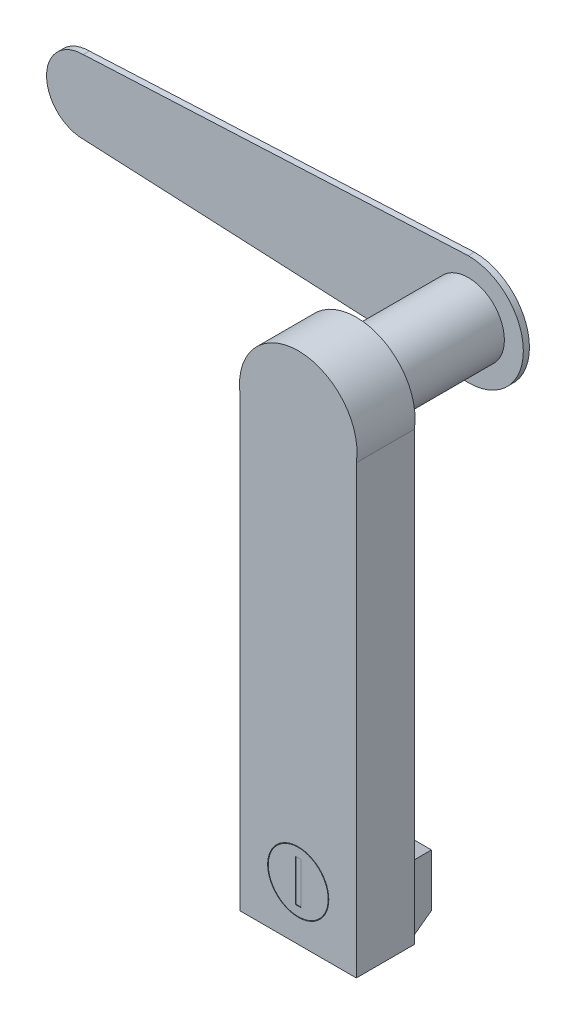
ISO-10303-21;
HEADER;
FILE_DESCRIPTION(('STEP AP214'),'2;1');
FILE_NAME('part.step','',(''),(''),'','','');
FILE_SCHEMA(('AUTOMOTIVE_DESIGN { 1 0 10303 214 1 1 1 1 }'));
ENDSEC;
DATA;
#1=APPLICATION_CONTEXT('core data for automotive mechanical design processes');
#2=APPLICATION_PROTOCOL_DEFINITION('international standard','automotive_design',2000,#1);
#3=PRODUCT_CONTEXT('',#1,'mechanical');
#4=PRODUCT('Part','Part','',(#3));
#5=PRODUCT_RELATED_PRODUCT_CATEGORY('part','',(#4));
#6=PRODUCT_DEFINITION_FORMATION('','',#4);
#7=PRODUCT_DEFINITION_CONTEXT('part definition',#1,'design');
#8=PRODUCT_DEFINITION('design','',#6,#7);
#9=PRODUCT_DEFINITION_SHAPE('','',#8);
#10=(LENGTH_UNIT() NAMED_UNIT(*) SI_UNIT(.MILLI.,.METRE.));
#11=(NAMED_UNIT(*) PLANE_ANGLE_UNIT() SI_UNIT($,.RADIAN.));
#12=(NAMED_UNIT(*) SI_UNIT($,.STERADIAN.) SOLID_ANGLE_UNIT());
#13=UNCERTAINTY_MEASURE_WITH_UNIT(LENGTH_MEASURE(1.E-05),#10,'distance_accuracy_value','');
#14=(GEOMETRIC_REPRESENTATION_CONTEXT(3) GLOBAL_UNCERTAINTY_ASSIGNED_CONTEXT((#13)) GLOBAL_UNIT_ASSIGNED_CONTEXT((#10,
#11,#12)) REPRESENTATION_CONTEXT('',''));
#15=CARTESIAN_POINT('',(0.,0.,0.));
#16=DIRECTION('',(0.,0.,1.));
#17=DIRECTION('',(1.,0.,0.));
#18=AXIS2_PLACEMENT_3D('',#15,#16,#17);
#19=CARTESIAN_POINT('',(0.,37.5,-9.5));
#20=DIRECTION('',(0.,0.,1.));
#21=DIRECTION('',(1.,0.,0.));
#22=AXIS2_PLACEMENT_3D('',#19,#20,#21);
#23=PLANE('',#22);
#24=DIRECTION('',(0.,-1.,0.));
#25=VECTOR('',#24,1.);
#26=CARTESIAN_POINT('',(9.00000000000001,-36.5,-9.5));
#27=LINE('',#26,#25);
#28=CARTESIAN_POINT('',(9.00000000000001,-25.5,-9.5));
#29=VERTEX_POINT('',#28);
#30=CARTESIAN_POINT('',(9.00000000000001,-36.5,-9.5));
#31=VERTEX_POINT('',#30);
#32=EDGE_CURVE('E220',#29,#31,#27,.T.);
#33=ORIENTED_EDGE('',*,*,#32,.F.);
#34=DIRECTION('',(1.,0.,0.));
#35=VECTOR('',#34,1.);
#36=CARTESIAN_POINT('',(9.00000000000001,-25.5,-9.5));
#37=LINE('',#36,#35);
#38=CARTESIAN_POINT('',(-8.99999999999999,-25.5,-9.5));
#39=VERTEX_POINT('',#38);
#40=EDGE_CURVE('E227',#39,#29,#37,.T.);
#41=ORIENTED_EDGE('',*,*,#40,.F.);
#42=DIRECTION('',(0.,1.,0.));
#43=VECTOR('',#42,1.);
#44=CARTESIAN_POINT('',(-8.99999999999999,-36.5,-9.5));
#45=LINE('',#44,#43);
#46=CARTESIAN_POINT('',(-8.99999999999999,-36.5,-9.5));
#47=VERTEX_POINT('',#46);
#48=EDGE_CURVE('E224',#47,#39,#45,.T.);
#49=ORIENTED_EDGE('',*,*,#48,.F.);
#50=DIRECTION('',(-1.,0.,0.));
#51=VECTOR('',#50,1.);
#52=CARTESIAN_POINT('',(9.00000000000001,-36.5,-9.5));
#53=LINE('',#52,#51);
#54=EDGE_CURVE('E55',#31,#47,#53,.T.);
#55=ORIENTED_EDGE('',*,*,#54,.F.);
#56=EDGE_LOOP('',(#33,#41,#49,#55));
#57=FACE_BOUND('',#56,.T.);
#58=CARTESIAN_POINT('',(0.,37.5,-9.5));
#59=DIRECTION('',(0.,0.,1.));
#60=DIRECTION('',(1.,0.,0.));
#61=AXIS2_PLACEMENT_3D('',#58,#59,#60);
#62=CIRCLE('',#61,9.61769203083567);
#63=CARTESIAN_POINT('',(9.50000000000001,36.,-9.5));
#64=VERTEX_POINT('',#63);
#65=CARTESIAN_POINT('',(-9.5,36.,-9.5));
#66=VERTEX_POINT('',#65);
#67=EDGE_CURVE('E262',#64,#66,#62,.T.);
#68=ORIENTED_EDGE('',*,*,#67,.F.);
#69=DIRECTION('',(0.,1.,0.));
#70=VECTOR('',#69,1.);
#71=CARTESIAN_POINT('',(9.50000000000001,36.,-9.5));
#72=LINE('',#71,#70);
#73=CARTESIAN_POINT('',(9.50000000000001,-37.,-9.5));
#74=VERTEX_POINT('',#73);
#75=EDGE_CURVE('E271',#74,#64,#72,.T.);
#76=ORIENTED_EDGE('',*,*,#75,.F.);
#77=DIRECTION('',(1.,0.,0.));
#78=VECTOR('',#77,1.);
#79=CARTESIAN_POINT('',(-9.49999999999999,-37.,-9.5));
#80=LINE('',#79,#78);
#81=CARTESIAN_POINT('',(-9.49999999999999,-37.,-9.5));
#82=VERTEX_POINT('',#81);
#83=EDGE_CURVE('E268',#82,#74,#80,.T.);
#84=ORIENTED_EDGE('',*,*,#83,.F.);
#85=DIRECTION('',(0.,-1.,0.));
#86=VECTOR('',#85,1.);
#87=CARTESIAN_POINT('',(-9.5,36.,-9.5));
#88=LINE('',#87,#86);
#89=EDGE_CURVE('E265',#66,#82,#88,.T.);
#90=ORIENTED_EDGE('',*,*,#89,.F.);
#91=EDGE_LOOP('',(#68,#76,#84,#90));
#92=FACE_BOUND('',#91,.T.);
#93=CARTESIAN_POINT('',(-0.175629609615581,37.4977963845939,-9.5));
#94=DIRECTION('',(0.,0.,1.));
#95=DIRECTION('',(1.,0.,0.));
#96=AXIS2_PLACEMENT_3D('',#93,#94,#95);
#97=CIRCLE('',#96,5.9);
#98=CARTESIAN_POINT('',(5.72437039038442,37.4977963845939,-9.5));
#99=VERTEX_POINT('',#98);
#100=EDGE_CURVE('E11',#99,#99,#97,.F.);
#101=ORIENTED_EDGE('',*,*,#100,.F.);
#102=EDGE_LOOP('',(#101));
#103=FACE_BOUND('',#102,.T.);
#104=ADVANCED_FACE('F32',(#57,#92,#103),#23,.F.);
#105=CARTESIAN_POINT('',(0.,-28.1505705441596,-5.));
#106=DIRECTION('',(0.,0.,1.));
#107=DIRECTION('',(1.,0.,0.));
#108=AXIS2_PLACEMENT_3D('',#105,#106,#107);
#109=PLANE('',#108);
#110=CARTESIAN_POINT('',(0.,-28.1505705441596,-5.));
#111=DIRECTION('',(0.,0.,1.));
#112=DIRECTION('',(1.,0.,0.));
#113=AXIS2_PLACEMENT_3D('',#110,#111,#112);
#114=CIRCLE('',#113,5.);
#115=CARTESIAN_POINT('',(5.00000000000001,-28.1505705441596,-5.));
#116=VERTEX_POINT('',#115);
#117=EDGE_CURVE('E217',#116,#116,#114,.T.);
#118=ORIENTED_EDGE('',*,*,#117,.T.);
#119=EDGE_LOOP('',(#118));
#120=FACE_BOUND('',#119,.T.);
#121=CARTESIAN_POINT('',(0.,-28.1505705441596,-5.));
#122=DIRECTION('',(0.,0.,1.));
#123=DIRECTION('',(1.,0.,0.));
#124=AXIS2_PLACEMENT_3D('',#121,#122,#123);
#125=CIRCLE('',#124,4.9);
#126=CARTESIAN_POINT('',(4.90000000000001,-28.1505705441596,-5.));
#127=VERTEX_POINT('',#126);
#128=EDGE_CURVE('E203',#127,#127,#125,.T.);
#129=ORIENTED_EDGE('',*,*,#128,.F.);
#130=EDGE_LOOP('',(#129));
#131=FACE_BOUND('',#130,.T.);
#132=ADVANCED_FACE('F306',(#120,#131),#109,.T.);
#133=CARTESIAN_POINT('',(0.,37.5,-9.5));
#134=DIRECTION('',(0.,0.,1.));
#135=DIRECTION('',(1.,0.,0.));
#136=AXIS2_PLACEMENT_3D('',#133,#134,#135);
#137=CYLINDRICAL_SURFACE('',#136,9.61769203083567);
#138=CARTESIAN_POINT('',(0.,37.5,0.));
#139=DIRECTION('',(0.,0.,1.));
#140=DIRECTION('',(1.,0.,0.));
#141=AXIS2_PLACEMENT_3D('',#138,#139,#140);
#142=CIRCLE('',#141,9.61769203083567);
#143=CARTESIAN_POINT('',(9.50000000000001,36.,0.));
#144=VERTEX_POINT('',#143);
#145=CARTESIAN_POINT('',(-9.5,36.,0.));
#146=VERTEX_POINT('',#145);
#147=EDGE_CURVE('E233',#144,#146,#142,.T.);
#148=ORIENTED_EDGE('',*,*,#147,.F.);
#149=DIRECTION('',(0.,0.,1.));
#150=VECTOR('',#149,1.);
#151=CARTESIAN_POINT('',(9.50000000000001,36.,-9.5));
#152=LINE('',#151,#150);
#153=EDGE_CURVE('E40',#64,#144,#152,.T.);
#154=ORIENTED_EDGE('',*,*,#153,.F.);
#155=ORIENTED_EDGE('',*,*,#67,.T.);
#156=DIRECTION('',(0.,0.,1.));
#157=VECTOR('',#156,1.);
#158=CARTESIAN_POINT('',(-9.5,36.,-9.5));
#159=LINE('',#158,#157);
#160=EDGE_CURVE('E274',#66,#146,#159,.T.);
#161=ORIENTED_EDGE('',*,*,#160,.T.);
#162=EDGE_LOOP('',(#148,#154,#155,#161));
#163=FACE_BOUND('',#162,.T.);
#164=ADVANCED_FACE('F34',(#163),#137,.T.);
#165=CARTESIAN_POINT('',(9.50000000000001,36.,-9.5));
#166=DIRECTION('',(1.,0.,0.));
#167=DIRECTION('',(0.,1.,0.));
#168=AXIS2_PLACEMENT_3D('',#165,#166,#167);
#169=PLANE('',#168);
#170=DIRECTION('',(0.,1.,0.));
#171=VECTOR('',#170,1.);
#172=CARTESIAN_POINT('',(9.50000000000001,36.,0.));
#173=LINE('',#172,#171);
#174=CARTESIAN_POINT('',(9.50000000000001,-37.,0.));
#175=VERTEX_POINT('',#174);
#176=EDGE_CURVE('E259',#175,#144,#173,.T.);
#177=ORIENTED_EDGE('',*,*,#176,.F.);
#178=DIRECTION('',(0.,0.,1.));
#179=VECTOR('',#178,1.);
#180=CARTESIAN_POINT('',(9.50000000000001,-37.,-9.5));
#181=LINE('',#180,#179);
#182=EDGE_CURVE('E276',#74,#175,#181,.T.);
#183=ORIENTED_EDGE('',*,*,#182,.F.);
#184=ORIENTED_EDGE('',*,*,#75,.T.);
#185=ORIENTED_EDGE('',*,*,#153,.T.);
#186=EDGE_LOOP('',(#177,#183,#184,#185));
#187=FACE_BOUND('',#186,.T.);
#188=ADVANCED_FACE('F291',(#187),#169,.T.);
#189=CARTESIAN_POINT('',(-9.49999999999999,-37.,-9.5));
#190=DIRECTION('',(0.,-1.,0.));
#191=DIRECTION('',(0.,0.,-1.));
#192=AXIS2_PLACEMENT_3D('',#189,#190,#191);
#193=PLANE('',#192);
#194=DIRECTION('',(1.,0.,0.));
#195=VECTOR('',#194,1.);
#196=CARTESIAN_POINT('',(-9.49999999999999,-37.,0.));
#197=LINE('',#196,#195);
#198=CARTESIAN_POINT('',(-9.49999999999999,-37.,0.));
#199=VERTEX_POINT('',#198);
#200=EDGE_CURVE('E256',#199,#175,#197,.T.);
#201=ORIENTED_EDGE('',*,*,#200,.F.);
#202=DIRECTION('',(0.,0.,1.));
#203=VECTOR('',#202,1.);
#204=CARTESIAN_POINT('',(-9.49999999999999,-37.,-9.5));
#205=LINE('',#204,#203);
#206=EDGE_CURVE('E278',#82,#199,#205,.T.);
#207=ORIENTED_EDGE('',*,*,#206,.F.);
#208=ORIENTED_EDGE('',*,*,#83,.T.);
#209=ORIENTED_EDGE('',*,*,#182,.T.);
#210=EDGE_LOOP('',(#201,#207,#208,#209));
#211=FACE_BOUND('',#210,.T.);
#212=ADVANCED_FACE('F297',(#211),#193,.T.);
#213=CARTESIAN_POINT('',(-9.5,36.,-9.5));
#214=DIRECTION('',(-1.,0.,0.));
#215=DIRECTION('',(0.,-1.,0.));
#216=AXIS2_PLACEMENT_3D('',#213,#214,#215);
#217=PLANE('',#216);
#218=DIRECTION('',(0.,-1.,0.));
#219=VECTOR('',#218,1.);
#220=CARTESIAN_POINT('',(-9.5,36.,0.));
#221=LINE('',#220,#219);
#222=EDGE_CURVE('E253',#146,#199,#221,.T.);
#223=ORIENTED_EDGE('',*,*,#222,.F.);
#224=ORIENTED_EDGE('',*,*,#160,.F.);
#225=ORIENTED_EDGE('',*,*,#89,.T.);
#226=ORIENTED_EDGE('',*,*,#206,.T.);
#227=EDGE_LOOP('',(#223,#224,#225,#226));
#228=FACE_BOUND('',#227,.T.);
#229=ADVANCED_FACE('F285',(#228),#217,.T.);
#230=CARTESIAN_POINT('',(0.,37.5,0.));
#231=DIRECTION('',(0.,0.,1.));
#232=DIRECTION('',(1.,0.,0.));
#233=AXIS2_PLACEMENT_3D('',#230,#231,#232);
#234=PLANE('',#233);
#235=CARTESIAN_POINT('',(0.,-28.1505705441596,0.));
#236=DIRECTION('',(0.,0.,1.));
#237=DIRECTION('',(1.,0.,0.));
#238=AXIS2_PLACEMENT_3D('',#235,#236,#237);
#239=CIRCLE('',#238,5.);
#240=CARTESIAN_POINT('',(5.00000000000001,-28.1505705441596,0.));
#241=VERTEX_POINT('',#240);
#242=EDGE_CURVE('E214',#241,#241,#239,.T.);
#243=ORIENTED_EDGE('',*,*,#242,.F.);
#244=EDGE_LOOP('',(#243));
#245=FACE_BOUND('',#244,.T.);
#246=ORIENTED_EDGE('',*,*,#147,.T.);
#247=ORIENTED_EDGE('',*,*,#222,.T.);
#248=ORIENTED_EDGE('',*,*,#200,.T.);
#249=ORIENTED_EDGE('',*,*,#176,.T.);
#250=EDGE_LOOP('',(#246,#247,#248,#249));
#251=FACE_BOUND('',#250,.T.);
#252=ADVANCED_FACE('F288',(#245,#251),#234,.T.);
#253=CARTESIAN_POINT('',(9.00000000000001,-36.5,-9.5));
#254=DIRECTION('',(0.965925826289068,0.,-0.258819045102521));
#255=DIRECTION('',(-0.258819045102521,0.,-0.965925826289068));
#256=AXIS2_PLACEMENT_3D('',#253,#254,#255);
#257=PLANE('',#256);
#258=ORIENTED_EDGE('',*,*,#32,.T.);
#259=DIRECTION('',(0.250562807085732,-0.250562807085732,0.935113126531029));
#260=VECTOR('',#259,1.);
#261=CARTESIAN_POINT('',(9.00000000000001,-36.5,-9.5));
#262=LINE('',#261,#260);
#263=CARTESIAN_POINT('',(7.79422863405996,-35.2942286340599,-14.));
#264=VERTEX_POINT('',#263);
#265=EDGE_CURVE('E231',#264,#31,#262,.T.);
#266=ORIENTED_EDGE('',*,*,#265,.F.);
#267=DIRECTION('',(0.,1.,0.));
#268=VECTOR('',#267,1.);
#269=CARTESIAN_POINT('',(7.79422863405996,-25.5,-14.));
#270=LINE('',#269,#268);
#271=CARTESIAN_POINT('',(7.79422863405996,-26.7057713659401,-14.));
#272=VERTEX_POINT('',#271);
#273=EDGE_CURVE('E230',#272,#264,#270,.F.);
#274=ORIENTED_EDGE('',*,*,#273,.F.);
#275=DIRECTION('',(0.250562807085732,0.250562807085732,0.935113126531029));
#276=VECTOR('',#275,1.);
#277=CARTESIAN_POINT('',(8.30940107675851,-26.1905989232415,-12.0773502691896));
#278=LINE('',#277,#276);
#279=EDGE_CURVE('E235',#272,#29,#278,.T.);
#280=ORIENTED_EDGE('',*,*,#279,.T.);
#281=EDGE_LOOP('',(#258,#266,#274,#280));
#282=FACE_BOUND('',#281,.T.);
#283=ADVANCED_FACE('F316',(#282),#257,.T.);
#284=CARTESIAN_POINT('',(9.00000000000001,-36.5,-9.5));
#285=DIRECTION('',(0.,-0.965925826289068,-0.258819045102521));
#286=DIRECTION('',(0.,0.258819045102521,-0.965925826289068));
#287=AXIS2_PLACEMENT_3D('',#284,#285,#286);
#288=PLANE('',#287);
#289=ORIENTED_EDGE('',*,*,#54,.T.);
#290=DIRECTION('',(-0.250562807085732,-0.250562807085732,0.935113126531029));
#291=VECTOR('',#290,1.);
#292=CARTESIAN_POINT('',(-8.99999999999999,-36.5,-9.5));
#293=LINE('',#292,#291);
#294=CARTESIAN_POINT('',(-7.79422863405994,-35.2942286340599,-14.));
#295=VERTEX_POINT('',#294);
#296=EDGE_CURVE('E234',#295,#47,#293,.T.);
#297=ORIENTED_EDGE('',*,*,#296,.F.);
#298=DIRECTION('',(1.,0.,0.));
#299=VECTOR('',#298,1.);
#300=CARTESIAN_POINT('',(9.00000000000001,-35.2942286340599,-14.));
#301=LINE('',#300,#299);
#302=EDGE_CURVE('E246',#264,#295,#301,.F.);
#303=ORIENTED_EDGE('',*,*,#302,.F.);
#304=ORIENTED_EDGE('',*,*,#265,.T.);
#305=EDGE_LOOP('',(#289,#297,#303,#304));
#306=FACE_BOUND('',#305,.T.);
#307=ADVANCED_FACE('F318',(#306),#288,.T.);
#308=CARTESIAN_POINT('',(-8.99999999999999,-36.5,-9.5));
#309=DIRECTION('',(-0.965925826289068,0.,-0.258819045102521));
#310=DIRECTION('',(-0.258819045102521,0.,0.965925826289068));
#311=AXIS2_PLACEMENT_3D('',#308,#309,#310);
#312=PLANE('',#311);
#313=ORIENTED_EDGE('',*,*,#48,.T.);
#314=DIRECTION('',(-0.250562807085732,0.250562807085732,0.935113126531029));
#315=VECTOR('',#314,1.);
#316=CARTESIAN_POINT('',(-7.86992903469572,-26.6300709653043,-13.7174822586739));
#317=LINE('',#316,#315);
#318=CARTESIAN_POINT('',(-7.79422863405993,-26.7057713659401,-14.));
#319=VERTEX_POINT('',#318);
#320=EDGE_CURVE('E238',#319,#39,#317,.T.);
#321=ORIENTED_EDGE('',*,*,#320,.F.);
#322=DIRECTION('',(0.,-1.,0.));
#323=VECTOR('',#322,1.);
#324=CARTESIAN_POINT('',(-7.79422863405993,-25.5,-14.));
#325=LINE('',#324,#323);
#326=EDGE_CURVE('E248',#295,#319,#325,.F.);
#327=ORIENTED_EDGE('',*,*,#326,.F.);
#328=ORIENTED_EDGE('',*,*,#296,.T.);
#329=EDGE_LOOP('',(#313,#321,#327,#328));
#330=FACE_BOUND('',#329,.T.);
#331=ADVANCED_FACE('F321',(#330),#312,.T.);
#332=CARTESIAN_POINT('',(9.00000000000001,-25.5,-9.5));
#333=DIRECTION('',(0.,0.965925826289068,-0.258819045102521));
#334=DIRECTION('',(0.,0.258819045102521,0.965925826289068));
#335=AXIS2_PLACEMENT_3D('',#332,#333,#334);
#336=PLANE('',#335);
#337=ORIENTED_EDGE('',*,*,#40,.T.);
#338=ORIENTED_EDGE('',*,*,#279,.F.);
#339=DIRECTION('',(-1.,0.,0.));
#340=VECTOR('',#339,1.);
#341=CARTESIAN_POINT('',(9.00000000000001,-26.7057713659401,-14.));
#342=LINE('',#341,#340);
#343=EDGE_CURVE('E239',#319,#272,#342,.F.);
#344=ORIENTED_EDGE('',*,*,#343,.F.);
#345=ORIENTED_EDGE('',*,*,#320,.T.);
#346=EDGE_LOOP('',(#337,#338,#344,#345));
#347=FACE_BOUND('',#346,.T.);
#348=ADVANCED_FACE('F325',(#347),#336,.T.);
#349=CARTESIAN_POINT('',(9.00000000000001,-25.5,-14.));
#350=DIRECTION('',(0.,0.,1.));
#351=DIRECTION('',(1.,0.,0.));
#352=AXIS2_PLACEMENT_3D('',#349,#350,#351);
#353=PLANE('',#352);
#354=ORIENTED_EDGE('',*,*,#273,.T.);
#355=ORIENTED_EDGE('',*,*,#302,.T.);
#356=ORIENTED_EDGE('',*,*,#326,.T.);
#357=ORIENTED_EDGE('',*,*,#343,.T.);
#358=EDGE_LOOP('',(#354,#355,#356,#357));
#359=FACE_BOUND('',#358,.T.);
#360=ADVANCED_FACE('F329',(#359),#353,.F.);
#361=CARTESIAN_POINT('',(0.,-28.1505705441596,-5.));
#362=DIRECTION('',(0.,0.,1.));
#363=DIRECTION('',(1.,0.,0.));
#364=AXIS2_PLACEMENT_3D('',#361,#362,#363);
#365=CYLINDRICAL_SURFACE('',#364,5.);
#366=ORIENTED_EDGE('',*,*,#117,.F.);
#367=EDGE_LOOP('',(#366));
#368=FACE_BOUND('',#367,.T.);
#369=ORIENTED_EDGE('',*,*,#242,.T.);
#370=EDGE_LOOP('',(#369));
#371=FACE_BOUND('',#370,.T.);
#372=ADVANCED_FACE('F336',(#368,#371),#365,.F.);
#373=CARTESIAN_POINT('',(0.,-28.1505705441596,0.));
#374=DIRECTION('',(0.,0.,-1.));
#375=DIRECTION('',(-1.,0.,0.));
#376=AXIS2_PLACEMENT_3D('',#373,#374,#375);
#377=CYLINDRICAL_SURFACE('',#376,4.9);
#378=CARTESIAN_POINT('',(0.,-28.1505705441596,0.));
#379=DIRECTION('',(0.,0.,1.));
#380=DIRECTION('',(1.,0.,0.));
#381=AXIS2_PLACEMENT_3D('',#378,#379,#380);
#382=CIRCLE('',#381,4.9);
#383=CARTESIAN_POINT('',(4.90000000000001,-28.1505705441596,0.));
#384=VERTEX_POINT('',#383);
#385=EDGE_CURVE('E211',#384,#384,#382,.T.);
#386=ORIENTED_EDGE('',*,*,#385,.F.);
#387=EDGE_LOOP('',(#386));
#388=FACE_BOUND('',#387,.T.);
#389=ORIENTED_EDGE('',*,*,#128,.T.);
#390=EDGE_LOOP('',(#389));
#391=FACE_BOUND('',#390,.T.);
#392=ADVANCED_FACE('F339',(#388,#391),#377,.T.);
#393=CARTESIAN_POINT('',(0.,-28.1505705441596,0.));
#394=DIRECTION('',(0.,0.,1.));
#395=DIRECTION('',(1.,0.,0.));
#396=AXIS2_PLACEMENT_3D('',#393,#394,#395);
#397=PLANE('',#396);
#398=DIRECTION('',(0.,-1.,0.));
#399=VECTOR('',#398,1.);
#400=CARTESIAN_POINT('',(-0.489117432040876,-24.7310171909187,0.));
#401=LINE('',#400,#399);
#402=CARTESIAN_POINT('',(-0.489117432040876,-24.7310171909187,0.));
#403=VERTEX_POINT('',#402);
#404=CARTESIAN_POINT('',(-0.489117432040876,-31.5701238974005,0.));
#405=VERTEX_POINT('',#404);
#406=EDGE_CURVE('E47',#403,#405,#401,.T.);
#407=ORIENTED_EDGE('',*,*,#406,.F.);
#408=DIRECTION('',(-1.,0.,0.));
#409=VECTOR('',#408,1.);
#410=CARTESIAN_POINT('',(-0.489117432040876,-24.7310171909187,0.));
#411=LINE('',#410,#409);
#412=CARTESIAN_POINT('',(0.489117432040899,-24.7310171909187,0.));
#413=VERTEX_POINT('',#412);
#414=EDGE_CURVE('E185',#413,#403,#411,.T.);
#415=ORIENTED_EDGE('',*,*,#414,.F.);
#416=DIRECTION('',(0.,1.,0.));
#417=VECTOR('',#416,1.);
#418=CARTESIAN_POINT('',(0.489117432040899,-24.7310171909187,0.));
#419=LINE('',#418,#417);
#420=CARTESIAN_POINT('',(0.489117432040899,-31.5701238974005,0.));
#421=VERTEX_POINT('',#420);
#422=EDGE_CURVE('E182',#421,#413,#419,.T.);
#423=ORIENTED_EDGE('',*,*,#422,.F.);
#424=DIRECTION('',(1.,0.,0.));
#425=VECTOR('',#424,1.);
#426=CARTESIAN_POINT('',(-0.489117432040876,-31.5701238974005,0.));
#427=LINE('',#426,#425);
#428=EDGE_CURVE('E179',#405,#421,#427,.T.);
#429=ORIENTED_EDGE('',*,*,#428,.F.);
#430=EDGE_LOOP('',(#407,#415,#423,#429));
#431=FACE_BOUND('',#430,.T.);
#432=ORIENTED_EDGE('',*,*,#385,.T.);
#433=EDGE_LOOP('',(#432));
#434=FACE_BOUND('',#433,.T.);
#435=ADVANCED_FACE('F344',(#431,#434),#397,.T.);
#436=CARTESIAN_POINT('',(-0.489117432040876,-24.7310171909187,-0.1));
#437=DIRECTION('',(-1.,0.,0.));
#438=DIRECTION('',(0.,0.,1.));
#439=AXIS2_PLACEMENT_3D('',#436,#437,#438);
#440=PLANE('',#439);
#441=ORIENTED_EDGE('',*,*,#406,.T.);
#442=DIRECTION('',(0.,0.,1.));
#443=VECTOR('',#442,1.);
#444=CARTESIAN_POINT('',(-0.489117432040876,-31.5701238974005,-0.1));
#445=LINE('',#444,#443);
#446=CARTESIAN_POINT('',(-0.489117432040876,-31.5701238974005,-0.1));
#447=VERTEX_POINT('',#446);
#448=EDGE_CURVE('E200',#447,#405,#445,.T.);
#449=ORIENTED_EDGE('',*,*,#448,.F.);
#450=DIRECTION('',(0.,-1.,0.));
#451=VECTOR('',#450,1.);
#452=CARTESIAN_POINT('',(-0.489117432040876,-24.7310171909187,-0.1));
#453=LINE('',#452,#451);
#454=CARTESIAN_POINT('',(-0.489117432040876,-24.7310171909187,-0.1));
#455=VERTEX_POINT('',#454);
#456=EDGE_CURVE('E188',#455,#447,#453,.T.);
#457=ORIENTED_EDGE('',*,*,#456,.F.);
#458=DIRECTION('',(0.,0.,1.));
#459=VECTOR('',#458,1.);
#460=CARTESIAN_POINT('',(-0.489117432040876,-24.7310171909187,-0.1));
#461=LINE('',#460,#459);
#462=EDGE_CURVE('E201',#455,#403,#461,.T.);
#463=ORIENTED_EDGE('',*,*,#462,.T.);
#464=EDGE_LOOP('',(#441,#449,#457,#463));
#465=FACE_BOUND('',#464,.T.);
#466=ADVANCED_FACE('F348',(#465),#440,.F.);
#467=CARTESIAN_POINT('',(-0.489117432040876,-24.7310171909187,-0.1));
#468=DIRECTION('',(0.,1.,0.));
#469=DIRECTION('',(0.,0.,1.));
#470=AXIS2_PLACEMENT_3D('',#467,#468,#469);
#471=PLANE('',#470);
#472=ORIENTED_EDGE('',*,*,#414,.T.);
#473=ORIENTED_EDGE('',*,*,#462,.F.);
#474=DIRECTION('',(-1.,0.,0.));
#475=VECTOR('',#474,1.);
#476=CARTESIAN_POINT('',(-0.489117432040876,-24.7310171909187,-0.1));
#477=LINE('',#476,#475);
#478=CARTESIAN_POINT('',(0.489117432040899,-24.7310171909187,-0.1));
#479=VERTEX_POINT('',#478);
#480=EDGE_CURVE('E197',#479,#455,#477,.T.);
#481=ORIENTED_EDGE('',*,*,#480,.F.);
#482=DIRECTION('',(0.,0.,1.));
#483=VECTOR('',#482,1.);
#484=CARTESIAN_POINT('',(0.489117432040899,-24.7310171909187,-0.1));
#485=LINE('',#484,#483);
#486=EDGE_CURVE('E204',#479,#413,#485,.T.);
#487=ORIENTED_EDGE('',*,*,#486,.T.);
#488=EDGE_LOOP('',(#472,#473,#481,#487));
#489=FACE_BOUND('',#488,.T.);
#490=ADVANCED_FACE('F352',(#489),#471,.F.);
#491=CARTESIAN_POINT('',(0.489117432040899,-24.7310171909187,-0.1));
#492=DIRECTION('',(1.,0.,0.));
#493=DIRECTION('',(0.,0.,-1.));
#494=AXIS2_PLACEMENT_3D('',#491,#492,#493);
#495=PLANE('',#494);
#496=ORIENTED_EDGE('',*,*,#422,.T.);
#497=ORIENTED_EDGE('',*,*,#486,.F.);
#498=DIRECTION('',(0.,1.,0.));
#499=VECTOR('',#498,1.);
#500=CARTESIAN_POINT('',(0.489117432040899,-24.7310171909187,-0.1));
#501=LINE('',#500,#499);
#502=CARTESIAN_POINT('',(0.489117432040899,-31.5701238974005,-0.1));
#503=VERTEX_POINT('',#502);
#504=EDGE_CURVE('E194',#503,#479,#501,.T.);
#505=ORIENTED_EDGE('',*,*,#504,.F.);
#506=DIRECTION('',(0.,0.,1.));
#507=VECTOR('',#506,1.);
#508=CARTESIAN_POINT('',(0.489117432040899,-31.5701238974005,-0.1));
#509=LINE('',#508,#507);
#510=EDGE_CURVE('E206',#503,#421,#509,.T.);
#511=ORIENTED_EDGE('',*,*,#510,.T.);
#512=EDGE_LOOP('',(#496,#497,#505,#511));
#513=FACE_BOUND('',#512,.T.);
#514=ADVANCED_FACE('F357',(#513),#495,.F.);
#515=CARTESIAN_POINT('',(-0.489117432040876,-31.5701238974005,-0.1));
#516=DIRECTION('',(0.,-1.,0.));
#517=DIRECTION('',(0.,0.,-1.));
#518=AXIS2_PLACEMENT_3D('',#515,#516,#517);
#519=PLANE('',#518);
#520=ORIENTED_EDGE('',*,*,#428,.T.);
#521=ORIENTED_EDGE('',*,*,#510,.F.);
#522=DIRECTION('',(1.,0.,0.));
#523=VECTOR('',#522,1.);
#524=CARTESIAN_POINT('',(-0.489117432040876,-31.5701238974005,-0.1));
#525=LINE('',#524,#523);
#526=EDGE_CURVE('E191',#447,#503,#525,.T.);
#527=ORIENTED_EDGE('',*,*,#526,.F.);
#528=ORIENTED_EDGE('',*,*,#448,.T.);
#529=EDGE_LOOP('',(#520,#521,#527,#528));
#530=FACE_BOUND('',#529,.T.);
#531=ADVANCED_FACE('F353',(#530),#519,.F.);
#532=CARTESIAN_POINT('',(-0.489117432040876,-31.5701238974005,-0.1));
#533=DIRECTION('',(0.,0.,1.));
#534=DIRECTION('',(1.,0.,0.));
#535=AXIS2_PLACEMENT_3D('',#532,#533,#534);
#536=PLANE('',#535);
#537=ORIENTED_EDGE('',*,*,#456,.T.);
#538=ORIENTED_EDGE('',*,*,#526,.T.);
#539=ORIENTED_EDGE('',*,*,#504,.T.);
#540=ORIENTED_EDGE('',*,*,#480,.T.);
#541=EDGE_LOOP('',(#537,#538,#539,#540));
#542=FACE_BOUND('',#541,.T.);
#543=ADVANCED_FACE('F356',(#542),#536,.T.);
#544=CARTESIAN_POINT('',(-0.175629609615581,37.4977963845939,-28.));
#545=DIRECTION('',(0.,0.,1.));
#546=DIRECTION('',(1.,0.,0.));
#547=AXIS2_PLACEMENT_3D('',#544,#545,#546);
#548=CYLINDRICAL_SURFACE('',#547,5.9);
#549=CARTESIAN_POINT('',(-0.175629609615581,37.4977963845939,-28.));
#550=DIRECTION('',(0.,0.,-1.));
#551=DIRECTION('',(-1.,0.,0.));
#552=AXIS2_PLACEMENT_3D('',#549,#550,#551);
#553=CIRCLE('',#552,5.9);
#554=CARTESIAN_POINT('',(-6.07562960961558,37.4977963845939,-28.));
#555=VERTEX_POINT('',#554);
#556=EDGE_CURVE('E170',#555,#555,#553,.T.);
#557=ORIENTED_EDGE('',*,*,#556,.F.);
#558=EDGE_LOOP('',(#557));
#559=FACE_BOUND('',#558,.T.);
#560=ORIENTED_EDGE('',*,*,#100,.T.);
#561=EDGE_LOOP('',(#560));
#562=FACE_BOUND('',#561,.T.);
#563=ADVANCED_FACE('F367',(#559,#562),#548,.T.);
#564=CARTESIAN_POINT('',(-0.175629609615581,37.4977963845939,-28.));
#565=DIRECTION('',(0.,0.,-1.));
#566=DIRECTION('',(-1.,0.,0.));
#567=AXIS2_PLACEMENT_3D('',#564,#565,#566);
#568=PLANE('',#567);
#569=CARTESIAN_POINT('',(-0.175629609615581,37.4977963845939,-28.));
#570=DIRECTION('',(0.,0.,-1.));
#571=DIRECTION('',(-1.,0.,0.));
#572=AXIS2_PLACEMENT_3D('',#569,#570,#571);
#573=CIRCLE('',#572,9.);
#574=CARTESIAN_POINT('',(-0.175629609615581,46.4977963845939,-28.));
#575=VERTEX_POINT('',#574);
#576=CARTESIAN_POINT('',(-0.175629609615581,28.4977963845939,-28.));
#577=VERTEX_POINT('',#576);
#578=EDGE_CURVE('E169',#575,#577,#573,.T.);
#579=ORIENTED_EDGE('',*,*,#578,.F.);
#580=DIRECTION('',(0.998868137724438,0.0475651494154493,0.));
#581=VECTOR('',#580,1.);
#582=CARTESIAN_POINT('',(-0.175629609615581,46.4977963845939,-28.));
#583=LINE('',#582,#581);
#584=CARTESIAN_POINT('',(-63.1756296096156,43.4977963845939,-28.));
#585=VERTEX_POINT('',#584);
#586=EDGE_CURVE('E165',#585,#575,#583,.T.);
#587=ORIENTED_EDGE('',*,*,#586,.F.);
#588=CARTESIAN_POINT('',(-63.1756296096156,37.4977963845939,-28.));
#589=DIRECTION('',(0.,0.,-1.));
#590=DIRECTION('',(-1.,0.,0.));
#591=AXIS2_PLACEMENT_3D('',#588,#589,#590);
#592=CIRCLE('',#591,6.00000000000001);
#593=CARTESIAN_POINT('',(-63.1756296096156,31.4977963845939,-28.));
#594=VERTEX_POINT('',#593);
#595=EDGE_CURVE('E556',#594,#585,#592,.T.);
#596=ORIENTED_EDGE('',*,*,#595,.F.);
#597=DIRECTION('',(-0.998868137724438,0.0475651494154493,0.));
#598=VECTOR('',#597,1.);
#599=CARTESIAN_POINT('',(-63.1756296096156,31.4977963845939,-28.));
#600=LINE('',#599,#598);
#601=EDGE_CURVE('E554',#577,#594,#600,.T.);
#602=ORIENTED_EDGE('',*,*,#601,.F.);
#603=EDGE_LOOP('',(#579,#587,#596,#602));
#604=FACE_BOUND('',#603,.T.);
#605=ORIENTED_EDGE('',*,*,#556,.T.);
#606=EDGE_LOOP('',(#605));
#607=FACE_BOUND('',#606,.T.);
#608=ADVANCED_FACE('F371',(#604,#607),#568,.F.);
#609=CARTESIAN_POINT('',(-0.175629609615581,37.4977963845939,-29.));
#610=DIRECTION('',(0.,0.,1.));
#611=DIRECTION('',(1.,0.,0.));
#612=AXIS2_PLACEMENT_3D('',#609,#610,#611);
#613=CYLINDRICAL_SURFACE('',#612,9.);
#614=ORIENTED_EDGE('',*,*,#578,.T.);
#615=DIRECTION('',(0.,0.,1.));
#616=VECTOR('',#615,1.);
#617=CARTESIAN_POINT('',(-0.175629609615581,28.4977963845939,-29.));
#618=LINE('',#617,#616);
#619=CARTESIAN_POINT('',(-0.175629609615581,28.4977963845939,-29.));
#620=VERTEX_POINT('',#619);
#621=EDGE_CURVE('E149',#620,#577,#618,.T.);
#622=ORIENTED_EDGE('',*,*,#621,.F.);
#623=CARTESIAN_POINT('',(-0.175629609615581,37.4977963845939,-29.));
#624=DIRECTION('',(0.,0.,-1.));
#625=DIRECTION('',(-1.,0.,0.));
#626=AXIS2_PLACEMENT_3D('',#623,#624,#625);
#627=CIRCLE('',#626,9.);
#628=CARTESIAN_POINT('',(-0.175629609615581,46.4977963845939,-29.));
#629=VERTEX_POINT('',#628);
#630=EDGE_CURVE('E156',#629,#620,#627,.T.);
#631=ORIENTED_EDGE('',*,*,#630,.F.);
#632=DIRECTION('',(0.,0.,1.));
#633=VECTOR('',#632,1.);
#634=CARTESIAN_POINT('',(-0.175629609615581,46.4977963845939,-29.));
#635=LINE('',#634,#633);
#636=EDGE_CURVE('E563',#629,#575,#635,.T.);
#637=ORIENTED_EDGE('',*,*,#636,.T.);
#638=EDGE_LOOP('',(#614,#622,#631,#637));
#639=FACE_BOUND('',#638,.T.);
#640=ADVANCED_FACE('F167',(#639),#613,.T.);
#641=CARTESIAN_POINT('',(-63.1756296096156,31.4977963845939,-29.));
#642=DIRECTION('',(0.0475651494154493,0.998868137724437,0.));
#643=DIRECTION('',(-0.998868137724438,0.0475651494154493,0.));
#644=AXIS2_PLACEMENT_3D('',#641,#642,#643);
#645=PLANE('',#644);
#646=ORIENTED_EDGE('',*,*,#601,.T.);
#647=DIRECTION('',(0.,0.,1.));
#648=VECTOR('',#647,1.);
#649=CARTESIAN_POINT('',(-63.1756296096156,31.4977963845939,-29.));
#650=LINE('',#649,#648);
#651=CARTESIAN_POINT('',(-63.1756296096156,31.4977963845939,-29.));
#652=VERTEX_POINT('',#651);
#653=EDGE_CURVE('E152',#652,#594,#650,.T.);
#654=ORIENTED_EDGE('',*,*,#653,.F.);
#655=DIRECTION('',(-0.998868137724438,0.0475651494154493,0.));
#656=VECTOR('',#655,1.);
#657=CARTESIAN_POINT('',(-63.1756296096156,31.4977963845939,-29.));
#658=LINE('',#657,#656);
#659=EDGE_CURVE('E145',#620,#652,#658,.T.);
#660=ORIENTED_EDGE('',*,*,#659,.F.);
#661=ORIENTED_EDGE('',*,*,#621,.T.);
#662=EDGE_LOOP('',(#646,#654,#660,#661));
#663=FACE_BOUND('',#662,.T.);
#664=ADVANCED_FACE('F147',(#663),#645,.F.);
#665=CARTESIAN_POINT('',(-63.1756296096156,37.4977963845939,-29.));
#666=DIRECTION('',(0.,0.,1.));
#667=DIRECTION('',(1.,0.,0.));
#668=AXIS2_PLACEMENT_3D('',#665,#666,#667);
#669=CYLINDRICAL_SURFACE('',#668,6.00000000000001);
#670=ORIENTED_EDGE('',*,*,#595,.T.);
#671=DIRECTION('',(0.,0.,1.));
#672=VECTOR('',#671,1.);
#673=CARTESIAN_POINT('',(-63.1756296096156,43.4977963845939,-29.));
#674=LINE('',#673,#672);
#675=CARTESIAN_POINT('',(-63.1756296096156,43.4977963845939,-29.));
#676=VERTEX_POINT('',#675);
#677=EDGE_CURVE('E174',#676,#585,#674,.T.);
#678=ORIENTED_EDGE('',*,*,#677,.F.);
#679=CARTESIAN_POINT('',(-63.1756296096156,37.4977963845939,-29.));
#680=DIRECTION('',(0.,0.,-1.));
#681=DIRECTION('',(-1.,0.,0.));
#682=AXIS2_PLACEMENT_3D('',#679,#680,#681);
#683=CIRCLE('',#682,6.00000000000001);
#684=EDGE_CURVE('E155',#652,#676,#683,.T.);
#685=ORIENTED_EDGE('',*,*,#684,.F.);
#686=ORIENTED_EDGE('',*,*,#653,.T.);
#687=EDGE_LOOP('',(#670,#678,#685,#686));
#688=FACE_BOUND('',#687,.T.);
#689=ADVANCED_FACE('F377',(#688),#669,.T.);
#690=CARTESIAN_POINT('',(-0.175629609615581,46.4977963845939,-29.));
#691=DIRECTION('',(0.0475651494154493,-0.998868137724437,0.));
#692=DIRECTION('',(0.998868137724438,0.0475651494154493,0.));
#693=AXIS2_PLACEMENT_3D('',#690,#691,#692);
#694=PLANE('',#693);
#695=ORIENTED_EDGE('',*,*,#586,.T.);
#696=ORIENTED_EDGE('',*,*,#636,.F.);
#697=DIRECTION('',(0.998868137724438,0.0475651494154493,0.));
#698=VECTOR('',#697,1.);
#699=CARTESIAN_POINT('',(-0.175629609615581,46.4977963845939,-29.));
#700=LINE('',#699,#698);
#701=EDGE_CURVE('E161',#676,#629,#700,.T.);
#702=ORIENTED_EDGE('',*,*,#701,.F.);
#703=ORIENTED_EDGE('',*,*,#677,.T.);
#704=EDGE_LOOP('',(#695,#696,#702,#703));
#705=FACE_BOUND('',#704,.T.);
#706=ADVANCED_FACE('F380',(#705),#694,.F.);
#707=CARTESIAN_POINT('',(-0.175629609615581,37.4977963845939,-29.));
#708=DIRECTION('',(0.,0.,-1.));
#709=DIRECTION('',(-1.,0.,0.));
#710=AXIS2_PLACEMENT_3D('',#707,#708,#709);
#711=PLANE('',#710);
#712=ORIENTED_EDGE('',*,*,#630,.T.);
#713=ORIENTED_EDGE('',*,*,#659,.T.);
#714=ORIENTED_EDGE('',*,*,#684,.T.);
#715=ORIENTED_EDGE('',*,*,#701,.T.);
#716=EDGE_LOOP('',(#712,#713,#714,#715));
#717=FACE_BOUND('',#716,.T.);
#718=ADVANCED_FACE('F159',(#717),#711,.T.);
#719=CLOSED_SHELL('',(#104,#132,#164,#188,#212,#229,#252,#283,#307,#331,#348,#360,#372,#392,
#435,#466,#490,#514,#531,#543,#563,#608,#640,#664,#689,#706,#718));
#720=MANIFOLD_SOLID_BREP('B2',#719);
#721=ADVANCED_BREP_SHAPE_REPRESENTATION('',(#18,#720),#14);
#722=SHAPE_DEFINITION_REPRESENTATION(#9,#721);
ENDSEC;
END-ISO-10303-21;
